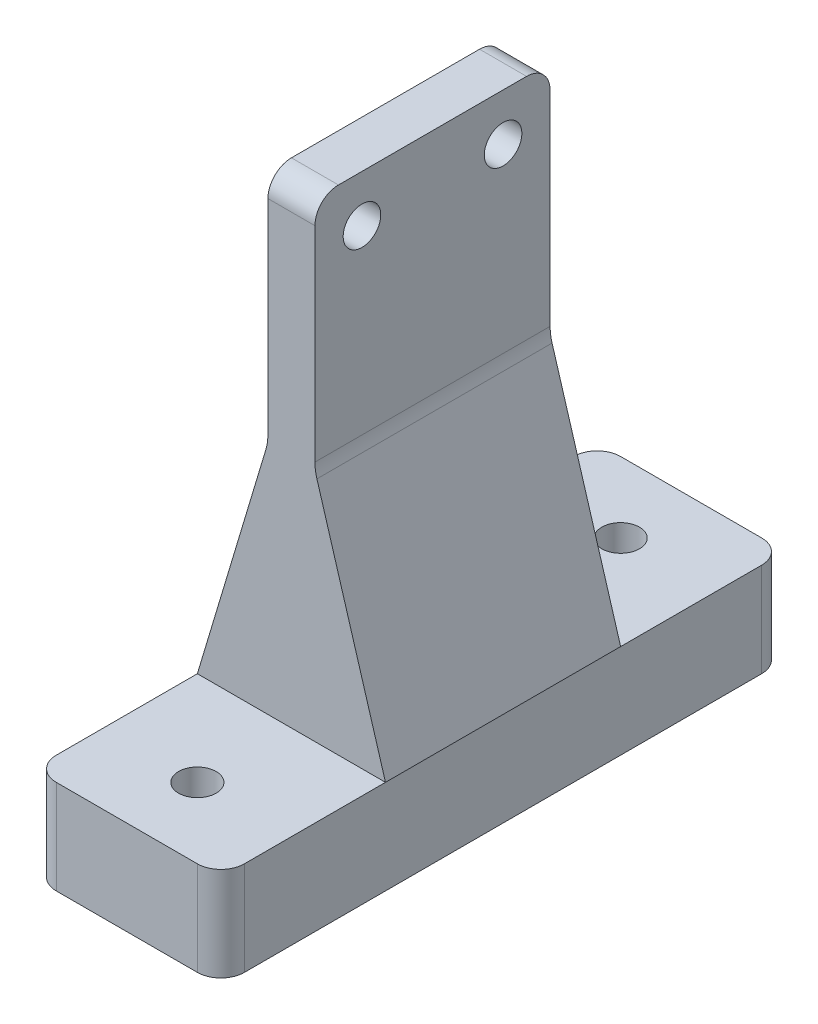
ISO-10303-21;
HEADER;
FILE_DESCRIPTION(('STEP AP214'),'2;1');
FILE_NAME('part.step','',(''),(''),'','','');
FILE_SCHEMA(('AUTOMOTIVE_DESIGN { 1 0 10303 214 1 1 1 1 }'));
ENDSEC;
DATA;
#1=APPLICATION_CONTEXT('core data for automotive mechanical design processes');
#2=APPLICATION_PROTOCOL_DEFINITION('international standard','automotive_design',2000,#1);
#3=PRODUCT_CONTEXT('',#1,'mechanical');
#4=PRODUCT('Part','Part','',(#3));
#5=PRODUCT_RELATED_PRODUCT_CATEGORY('part','',(#4));
#6=PRODUCT_DEFINITION_FORMATION('','',#4);
#7=PRODUCT_DEFINITION_CONTEXT('part definition',#1,'design');
#8=PRODUCT_DEFINITION('design','',#6,#7);
#9=PRODUCT_DEFINITION_SHAPE('','',#8);
#10=(LENGTH_UNIT() NAMED_UNIT(*) SI_UNIT(.MILLI.,.METRE.));
#11=(NAMED_UNIT(*) PLANE_ANGLE_UNIT() SI_UNIT($,.RADIAN.));
#12=(NAMED_UNIT(*) SI_UNIT($,.STERADIAN.) SOLID_ANGLE_UNIT());
#13=UNCERTAINTY_MEASURE_WITH_UNIT(LENGTH_MEASURE(1.E-05),#10,'distance_accuracy_value','');
#14=(GEOMETRIC_REPRESENTATION_CONTEXT(3) GLOBAL_UNCERTAINTY_ASSIGNED_CONTEXT((#13)) GLOBAL_UNIT_ASSIGNED_CONTEXT((#10,
#11,#12)) REPRESENTATION_CONTEXT('',''));
#15=CARTESIAN_POINT('',(0.,0.,0.));
#16=DIRECTION('',(0.,0.,1.));
#17=DIRECTION('',(1.,0.,0.));
#18=AXIS2_PLACEMENT_3D('',#15,#16,#17);
#19=CARTESIAN_POINT('',(0.,20.,0.));
#20=DIRECTION('',(0.,1.,0.));
#21=DIRECTION('',(0.,0.,1.));
#22=AXIS2_PLACEMENT_3D('',#19,#20,#21);
#23=PLANE('',#22);
#24=CARTESIAN_POINT('',(-4.99999999999999,20.,35.));
#25=DIRECTION('',(0.,1.,0.));
#26=DIRECTION('',(0.,0.,1.));
#27=AXIS2_PLACEMENT_3D('',#24,#25,#26);
#28=CIRCLE('',#27,4.);
#29=CARTESIAN_POINT('',(-4.99999999999999,20.,39.));
#30=VERTEX_POINT('',#29);
#31=EDGE_CURVE('E293',#30,#30,#28,.T.);
#32=ORIENTED_EDGE('',*,*,#31,.F.);
#33=EDGE_LOOP('',(#32));
#34=FACE_BOUND('',#33,.T.);
#35=DIRECTION('',(0.,0.,1.));
#36=VECTOR('',#35,1.);
#37=CARTESIAN_POINT('',(15.,20.,0.));
#38=LINE('',#37,#36);
#39=CARTESIAN_POINT('',(15.,20.,15.));
#40=VERTEX_POINT('',#39);
#41=CARTESIAN_POINT('',(15.,20.,45.));
#42=VERTEX_POINT('',#41);
#43=EDGE_CURVE('E210',#40,#42,#38,.T.);
#44=ORIENTED_EDGE('',*,*,#43,.F.);
#45=DIRECTION('',(1.,0.,0.));
#46=VECTOR('',#45,1.);
#47=CARTESIAN_POINT('',(-9.99999999999999,20.,15.));
#48=LINE('',#47,#46);
#49=CARTESIAN_POINT('',(-25.,20.,15.));
#50=VERTEX_POINT('',#49);
#51=EDGE_CURVE('E185',#50,#40,#48,.T.);
#52=ORIENTED_EDGE('',*,*,#51,.F.);
#53=DIRECTION('',(0.,0.,-1.));
#54=VECTOR('',#53,1.);
#55=CARTESIAN_POINT('',(-25.,20.,0.));
#56=LINE('',#55,#54);
#57=CARTESIAN_POINT('',(-25.,20.,45.));
#58=VERTEX_POINT('',#57);
#59=EDGE_CURVE('E345',#58,#50,#56,.T.);
#60=ORIENTED_EDGE('',*,*,#59,.F.);
#61=CARTESIAN_POINT('',(-20.,20.,45.));
#62=DIRECTION('',(0.,1.,0.));
#63=DIRECTION('',(0.,0.,1.));
#64=AXIS2_PLACEMENT_3D('',#61,#62,#63);
#65=CIRCLE('',#64,5.);
#66=CARTESIAN_POINT('',(-20.,20.,50.));
#67=VERTEX_POINT('',#66);
#68=EDGE_CURVE('E274',#58,#67,#65,.T.);
#69=ORIENTED_EDGE('',*,*,#68,.T.);
#70=DIRECTION('',(1.,0.,0.));
#71=VECTOR('',#70,1.);
#72=CARTESIAN_POINT('',(0.,20.,50.));
#73=LINE('',#72,#71);
#74=CARTESIAN_POINT('',(10.,20.,50.));
#75=VERTEX_POINT('',#74);
#76=EDGE_CURVE('E215',#67,#75,#73,.T.);
#77=ORIENTED_EDGE('',*,*,#76,.T.);
#78=CARTESIAN_POINT('',(10.,20.,45.));
#79=DIRECTION('',(0.,1.,0.));
#80=DIRECTION('',(0.,0.,1.));
#81=AXIS2_PLACEMENT_3D('',#78,#79,#80);
#82=CIRCLE('',#81,5.);
#83=EDGE_CURVE('E267',#75,#42,#82,.T.);
#84=ORIENTED_EDGE('',*,*,#83,.T.);
#85=EDGE_LOOP('',(#44,#52,#60,#69,#77,#84));
#86=FACE_BOUND('',#85,.T.);
#87=ADVANCED_FACE('F45',(#34,#86),#23,.T.);
#88=DIRECTION('',(-1.,0.,0.));
#89=VECTOR('',#88,1.);
#90=CARTESIAN_POINT('',(-10.,20.,-35.));
#91=LINE('',#90,#89);
#92=CARTESIAN_POINT('',(15.,20.,-35.));
#93=VERTEX_POINT('',#92);
#94=CARTESIAN_POINT('',(-25.,20.,-35.));
#95=VERTEX_POINT('',#94);
#96=EDGE_CURVE('E171',#93,#95,#91,.T.);
#97=ORIENTED_EDGE('',*,*,#96,.F.);
#98=CARTESIAN_POINT('',(15.,20.,-65.));
#99=VERTEX_POINT('',#98);
#100=EDGE_CURVE('E176',#99,#93,#38,.T.);
#101=ORIENTED_EDGE('',*,*,#100,.F.);
#102=CARTESIAN_POINT('',(9.99999999999998,20.,-65.));
#103=DIRECTION('',(0.,1.,0.));
#104=DIRECTION('',(0.,0.,1.));
#105=AXIS2_PLACEMENT_3D('',#102,#103,#104);
#106=CIRCLE('',#105,5.);
#107=CARTESIAN_POINT('',(9.99999999999998,20.,-70.));
#108=VERTEX_POINT('',#107);
#109=EDGE_CURVE('E270',#99,#108,#106,.T.);
#110=ORIENTED_EDGE('',*,*,#109,.T.);
#111=DIRECTION('',(1.,0.,0.));
#112=VECTOR('',#111,1.);
#113=CARTESIAN_POINT('',(0.,20.,-70.));
#114=LINE('',#113,#112);
#115=CARTESIAN_POINT('',(-20.,20.,-70.));
#116=VERTEX_POINT('',#115);
#117=EDGE_CURVE('E209',#116,#108,#114,.T.);
#118=ORIENTED_EDGE('',*,*,#117,.F.);
#119=CARTESIAN_POINT('',(-20.,20.,-65.));
#120=DIRECTION('',(0.,1.,0.));
#121=DIRECTION('',(0.,0.,1.));
#122=AXIS2_PLACEMENT_3D('',#119,#120,#121);
#123=CIRCLE('',#122,5.);
#124=CARTESIAN_POINT('',(-25.,20.,-65.));
#125=VERTEX_POINT('',#124);
#126=EDGE_CURVE('E272',#116,#125,#123,.T.);
#127=ORIENTED_EDGE('',*,*,#126,.T.);
#128=EDGE_CURVE('E179',#95,#125,#56,.T.);
#129=ORIENTED_EDGE('',*,*,#128,.F.);
#130=EDGE_LOOP('',(#97,#101,#110,#118,#127,#129));
#131=FACE_BOUND('',#130,.T.);
#132=CARTESIAN_POINT('',(-5.,20.,-55.));
#133=DIRECTION('',(0.,1.,0.));
#134=DIRECTION('',(0.,0.,1.));
#135=AXIS2_PLACEMENT_3D('',#132,#133,#134);
#136=CIRCLE('',#135,4.);
#137=CARTESIAN_POINT('',(-5.,20.,-51.));
#138=VERTEX_POINT('',#137);
#139=EDGE_CURVE('E323',#138,#138,#136,.T.);
#140=ORIENTED_EDGE('',*,*,#139,.F.);
#141=EDGE_LOOP('',(#140));
#142=FACE_BOUND('',#141,.T.);
#143=ADVANCED_FACE('F173',(#131,#142),#23,.T.);
#144=CARTESIAN_POINT('',(-25.,20.,0.));
#145=DIRECTION('',(-1.,0.,0.));
#146=DIRECTION('',(0.,0.,1.));
#147=AXIS2_PLACEMENT_3D('',#144,#145,#146);
#148=PLANE('',#147);
#149=DIRECTION('',(0.,0.,-1.));
#150=VECTOR('',#149,1.);
#151=CARTESIAN_POINT('',(-25.,0.,0.));
#152=LINE('',#151,#150);
#153=CARTESIAN_POINT('',(-25.,0.,45.));
#154=VERTEX_POINT('',#153);
#155=CARTESIAN_POINT('',(-25.,0.,-65.));
#156=VERTEX_POINT('',#155);
#157=EDGE_CURVE('E219',#154,#156,#152,.T.);
#158=ORIENTED_EDGE('',*,*,#157,.F.);
#159=DIRECTION('',(0.,-1.,0.));
#160=VECTOR('',#159,1.);
#161=CARTESIAN_POINT('',(-25.,20.,45.));
#162=LINE('',#161,#160);
#163=EDGE_CURVE('E265',#154,#58,#162,.F.);
#164=ORIENTED_EDGE('',*,*,#163,.T.);
#165=ORIENTED_EDGE('',*,*,#59,.T.);
#166=DIRECTION('',(0.,0.,1.));
#167=VECTOR('',#166,1.);
#168=CARTESIAN_POINT('',(-25.,20.,-35.));
#169=LINE('',#168,#167);
#170=EDGE_CURVE('E311',#95,#50,#169,.T.);
#171=ORIENTED_EDGE('',*,*,#170,.F.);
#172=ORIENTED_EDGE('',*,*,#128,.T.);
#173=DIRECTION('',(0.,-1.,0.));
#174=VECTOR('',#173,1.);
#175=CARTESIAN_POINT('',(-25.,20.,-65.));
#176=LINE('',#175,#174);
#177=EDGE_CURVE('E262',#125,#156,#176,.T.);
#178=ORIENTED_EDGE('',*,*,#177,.T.);
#179=EDGE_LOOP('',(#158,#164,#165,#171,#172,#178));
#180=FACE_BOUND('',#179,.T.);
#181=ADVANCED_FACE('F351',(#180),#148,.T.);
#182=CARTESIAN_POINT('',(0.,20.,50.));
#183=DIRECTION('',(0.,0.,-1.));
#184=DIRECTION('',(-1.,0.,0.));
#185=AXIS2_PLACEMENT_3D('',#182,#183,#184);
#186=PLANE('',#185);
#187=ORIENTED_EDGE('',*,*,#76,.F.);
#188=DIRECTION('',(0.,-1.,0.));
#189=VECTOR('',#188,1.);
#190=CARTESIAN_POINT('',(-20.,0.,50.));
#191=LINE('',#190,#189);
#192=CARTESIAN_POINT('',(-20.,0.,50.));
#193=VERTEX_POINT('',#192);
#194=EDGE_CURVE('E251',#67,#193,#191,.T.);
#195=ORIENTED_EDGE('',*,*,#194,.T.);
#196=DIRECTION('',(1.,0.,0.));
#197=VECTOR('',#196,1.);
#198=CARTESIAN_POINT('',(0.,0.,50.));
#199=LINE('',#198,#197);
#200=CARTESIAN_POINT('',(10.,0.,50.));
#201=VERTEX_POINT('',#200);
#202=EDGE_CURVE('E222',#193,#201,#199,.T.);
#203=ORIENTED_EDGE('',*,*,#202,.T.);
#204=DIRECTION('',(0.,-1.,0.));
#205=VECTOR('',#204,1.);
#206=CARTESIAN_POINT('',(10.,20.,50.));
#207=LINE('',#206,#205);
#208=EDGE_CURVE('E249',#201,#75,#207,.F.);
#209=ORIENTED_EDGE('',*,*,#208,.T.);
#210=EDGE_LOOP('',(#187,#195,#203,#209));
#211=FACE_BOUND('',#210,.T.);
#212=ADVANCED_FACE('F374',(#211),#186,.F.);
#213=CARTESIAN_POINT('',(15.,20.,0.));
#214=DIRECTION('',(1.,0.,0.));
#215=DIRECTION('',(0.,0.,-1.));
#216=AXIS2_PLACEMENT_3D('',#213,#214,#215);
#217=PLANE('',#216);
#218=DIRECTION('',(0.,0.,1.));
#219=VECTOR('',#218,1.);
#220=CARTESIAN_POINT('',(15.,0.,0.));
#221=LINE('',#220,#219);
#222=CARTESIAN_POINT('',(15.,0.,-65.));
#223=VERTEX_POINT('',#222);
#224=CARTESIAN_POINT('',(15.,0.,45.));
#225=VERTEX_POINT('',#224);
#226=EDGE_CURVE('E226',#223,#225,#221,.T.);
#227=ORIENTED_EDGE('',*,*,#226,.F.);
#228=DIRECTION('',(0.,-1.,0.));
#229=VECTOR('',#228,1.);
#230=CARTESIAN_POINT('',(15.,20.,-65.));
#231=LINE('',#230,#229);
#232=EDGE_CURVE('E208',#223,#99,#231,.F.);
#233=ORIENTED_EDGE('',*,*,#232,.T.);
#234=ORIENTED_EDGE('',*,*,#100,.T.);
#235=DIRECTION('',(0.,0.,1.));
#236=VECTOR('',#235,1.);
#237=CARTESIAN_POINT('',(15.,20.,-35.));
#238=LINE('',#237,#236);
#239=EDGE_CURVE('E191',#93,#40,#238,.T.);
#240=ORIENTED_EDGE('',*,*,#239,.T.);
#241=ORIENTED_EDGE('',*,*,#43,.T.);
#242=DIRECTION('',(0.,-1.,0.));
#243=VECTOR('',#242,1.);
#244=CARTESIAN_POINT('',(15.,0.,45.));
#245=LINE('',#244,#243);
#246=EDGE_CURVE('E281',#42,#225,#245,.T.);
#247=ORIENTED_EDGE('',*,*,#246,.T.);
#248=EDGE_LOOP('',(#227,#233,#234,#240,#241,#247));
#249=FACE_BOUND('',#248,.T.);
#250=ADVANCED_FACE('F206',(#249),#217,.T.);
#251=CARTESIAN_POINT('',(0.,20.,-70.));
#252=DIRECTION('',(0.,0.,-1.));
#253=DIRECTION('',(-1.,0.,0.));
#254=AXIS2_PLACEMENT_3D('',#251,#252,#253);
#255=PLANE('',#254);
#256=DIRECTION('',(1.,0.,0.));
#257=VECTOR('',#256,1.);
#258=CARTESIAN_POINT('',(0.,0.,-70.));
#259=LINE('',#258,#257);
#260=CARTESIAN_POINT('',(-20.,0.,-70.));
#261=VERTEX_POINT('',#260);
#262=CARTESIAN_POINT('',(9.99999999999998,0.,-70.));
#263=VERTEX_POINT('',#262);
#264=EDGE_CURVE('E229',#261,#263,#259,.T.);
#265=ORIENTED_EDGE('',*,*,#264,.F.);
#266=DIRECTION('',(0.,-1.,0.));
#267=VECTOR('',#266,1.);
#268=CARTESIAN_POINT('',(-20.,20.,-70.));
#269=LINE('',#268,#267);
#270=EDGE_CURVE('E279',#261,#116,#269,.F.);
#271=ORIENTED_EDGE('',*,*,#270,.T.);
#272=ORIENTED_EDGE('',*,*,#117,.T.);
#273=DIRECTION('',(0.,-1.,0.));
#274=VECTOR('',#273,1.);
#275=CARTESIAN_POINT('',(9.99999999999998,20.,-70.));
#276=LINE('',#275,#274);
#277=EDGE_CURVE('E276',#108,#263,#276,.T.);
#278=ORIENTED_EDGE('',*,*,#277,.T.);
#279=EDGE_LOOP('',(#265,#271,#272,#278));
#280=FACE_BOUND('',#279,.T.);
#281=ADVANCED_FACE('F363',(#280),#255,.T.);
#282=CARTESIAN_POINT('',(0.,0.,0.));
#283=DIRECTION('',(0.,1.,0.));
#284=DIRECTION('',(0.,0.,1.));
#285=AXIS2_PLACEMENT_3D('',#282,#283,#284);
#286=PLANE('',#285);
#287=CARTESIAN_POINT('',(-5.,0.,-55.));
#288=DIRECTION('',(0.,1.,0.));
#289=DIRECTION('',(0.,0.,1.));
#290=AXIS2_PLACEMENT_3D('',#287,#288,#289);
#291=CIRCLE('',#290,4.);
#292=CARTESIAN_POINT('',(-5.,0.,-51.));
#293=VERTEX_POINT('',#292);
#294=EDGE_CURVE('E320',#293,#293,#291,.T.);
#295=ORIENTED_EDGE('',*,*,#294,.T.);
#296=EDGE_LOOP('',(#295));
#297=FACE_BOUND('',#296,.T.);
#298=CARTESIAN_POINT('',(-4.99999999999999,0.,35.));
#299=DIRECTION('',(0.,1.,0.));
#300=DIRECTION('',(0.,0.,1.));
#301=AXIS2_PLACEMENT_3D('',#298,#299,#300);
#302=CIRCLE('',#301,4.);
#303=CARTESIAN_POINT('',(-4.99999999999999,0.,39.));
#304=VERTEX_POINT('',#303);
#305=EDGE_CURVE('E326',#304,#304,#302,.T.);
#306=ORIENTED_EDGE('',*,*,#305,.T.);
#307=EDGE_LOOP('',(#306));
#308=FACE_BOUND('',#307,.T.);
#309=ORIENTED_EDGE('',*,*,#202,.F.);
#310=CARTESIAN_POINT('',(-20.,0.,45.));
#311=DIRECTION('',(0.,1.,0.));
#312=DIRECTION('',(0.,0.,1.));
#313=AXIS2_PLACEMENT_3D('',#310,#311,#312);
#314=CIRCLE('',#313,5.);
#315=EDGE_CURVE('E260',#193,#154,#314,.F.);
#316=ORIENTED_EDGE('',*,*,#315,.T.);
#317=ORIENTED_EDGE('',*,*,#157,.T.);
#318=CARTESIAN_POINT('',(-20.,0.,-65.));
#319=DIRECTION('',(0.,1.,0.));
#320=DIRECTION('',(0.,0.,1.));
#321=AXIS2_PLACEMENT_3D('',#318,#319,#320);
#322=CIRCLE('',#321,5.);
#323=EDGE_CURVE('E258',#156,#261,#322,.F.);
#324=ORIENTED_EDGE('',*,*,#323,.T.);
#325=ORIENTED_EDGE('',*,*,#264,.T.);
#326=CARTESIAN_POINT('',(9.99999999999998,0.,-65.));
#327=DIRECTION('',(0.,1.,0.));
#328=DIRECTION('',(0.,0.,1.));
#329=AXIS2_PLACEMENT_3D('',#326,#327,#328);
#330=CIRCLE('',#329,5.);
#331=EDGE_CURVE('E256',#263,#223,#330,.F.);
#332=ORIENTED_EDGE('',*,*,#331,.T.);
#333=ORIENTED_EDGE('',*,*,#226,.T.);
#334=CARTESIAN_POINT('',(10.,0.,45.));
#335=DIRECTION('',(0.,1.,0.));
#336=DIRECTION('',(0.,0.,1.));
#337=AXIS2_PLACEMENT_3D('',#334,#335,#336);
#338=CIRCLE('',#337,5.);
#339=EDGE_CURVE('E254',#225,#201,#338,.F.);
#340=ORIENTED_EDGE('',*,*,#339,.T.);
#341=EDGE_LOOP('',(#309,#316,#317,#324,#325,#332,#333,#340));
#342=FACE_BOUND('',#341,.T.);
#343=ADVANCED_FACE('F361',(#297,#308,#342),#286,.F.);
#344=CARTESIAN_POINT('',(-10.,120.,-35.));
#345=DIRECTION('',(1.,0.,0.));
#346=DIRECTION('',(0.,0.,-1.));
#347=AXIS2_PLACEMENT_3D('',#344,#345,#346);
#348=PLANE('',#347);
#349=CARTESIAN_POINT('',(-9.99999999999999,110.,-25.));
#350=DIRECTION('',(-1.,0.,0.));
#351=DIRECTION('',(0.,0.,1.));
#352=AXIS2_PLACEMENT_3D('',#349,#350,#351);
#353=CIRCLE('',#352,4.);
#354=CARTESIAN_POINT('',(-9.99999999999999,110.,-21.));
#355=VERTEX_POINT('',#354);
#356=EDGE_CURVE('E290',#355,#355,#353,.T.);
#357=ORIENTED_EDGE('',*,*,#356,.F.);
#358=EDGE_LOOP('',(#357));
#359=FACE_BOUND('',#358,.T.);
#360=CARTESIAN_POINT('',(-9.99999999999999,110.,4.99999999999999));
#361=DIRECTION('',(-1.,0.,0.));
#362=DIRECTION('',(0.,0.,1.));
#363=AXIS2_PLACEMENT_3D('',#360,#361,#362);
#364=CIRCLE('',#363,4.);
#365=CARTESIAN_POINT('',(-9.99999999999999,110.,9.));
#366=VERTEX_POINT('',#365);
#367=EDGE_CURVE('E315',#366,#366,#364,.T.);
#368=ORIENTED_EDGE('',*,*,#367,.F.);
#369=EDGE_LOOP('',(#368));
#370=FACE_BOUND('',#369,.T.);
#371=DIRECTION('',(0.,-1.,0.));
#372=VECTOR('',#371,1.);
#373=CARTESIAN_POINT('',(-10.,120.,-35.));
#374=LINE('',#373,#372);
#375=CARTESIAN_POINT('',(-10.,115.,-35.));
#376=VERTEX_POINT('',#375);
#377=CARTESIAN_POINT('',(-10.,71.4676883630352,-35.));
#378=VERTEX_POINT('',#377);
#379=EDGE_CURVE('E336',#376,#378,#374,.T.);
#380=ORIENTED_EDGE('',*,*,#379,.T.);
#381=DIRECTION('',(0.,0.,1.));
#382=VECTOR('',#381,1.);
#383=CARTESIAN_POINT('',(-10.,71.4676883630352,-35.));
#384=LINE('',#383,#382);
#385=CARTESIAN_POINT('',(-9.99999999999999,71.4676883630352,15.));
#386=VERTEX_POINT('',#385);
#387=EDGE_CURVE('E285',#378,#386,#384,.T.);
#388=ORIENTED_EDGE('',*,*,#387,.T.);
#389=DIRECTION('',(0.,-1.,0.));
#390=VECTOR('',#389,1.);
#391=CARTESIAN_POINT('',(-9.99999999999999,120.,15.));
#392=LINE('',#391,#390);
#393=CARTESIAN_POINT('',(-9.99999999999999,115.,15.));
#394=VERTEX_POINT('',#393);
#395=EDGE_CURVE('E223',#394,#386,#392,.T.);
#396=ORIENTED_EDGE('',*,*,#395,.F.);
#397=CARTESIAN_POINT('',(-9.99999999999999,115.,9.99999999999999));
#398=DIRECTION('',(1.,0.,0.));
#399=DIRECTION('',(0.,0.,-1.));
#400=AXIS2_PLACEMENT_3D('',#397,#398,#399);
#401=CIRCLE('',#400,5.);
#402=CARTESIAN_POINT('',(-9.99999999999999,120.,9.99999999999998));
#403=VERTEX_POINT('',#402);
#404=EDGE_CURVE('E245',#394,#403,#401,.F.);
#405=ORIENTED_EDGE('',*,*,#404,.T.);
#406=DIRECTION('',(0.,0.,1.));
#407=VECTOR('',#406,1.);
#408=CARTESIAN_POINT('',(-10.,120.,-35.));
#409=LINE('',#408,#407);
#410=CARTESIAN_POINT('',(-10.,120.,-30.));
#411=VERTEX_POINT('',#410);
#412=EDGE_CURVE('E184',#411,#403,#409,.T.);
#413=ORIENTED_EDGE('',*,*,#412,.F.);
#414=CARTESIAN_POINT('',(-10.,115.,-30.));
#415=DIRECTION('',(1.,0.,0.));
#416=DIRECTION('',(0.,0.,-1.));
#417=AXIS2_PLACEMENT_3D('',#414,#415,#416);
#418=CIRCLE('',#417,5.);
#419=EDGE_CURVE('E243',#411,#376,#418,.F.);
#420=ORIENTED_EDGE('',*,*,#419,.T.);
#421=EDGE_LOOP('',(#380,#388,#396,#405,#413,#420));
#422=FACE_BOUND('',#421,.T.);
#423=ADVANCED_FACE('F391',(#359,#370,#422),#348,.F.);
#424=CARTESIAN_POINT('',(-9.99999999999999,120.,15.));
#425=DIRECTION('',(0.,0.,-1.));
#426=DIRECTION('',(-1.,0.,0.));
#427=AXIS2_PLACEMENT_3D('',#424,#425,#426);
#428=PLANE('',#427);
#429=DIRECTION('',(0.,-1.,0.));
#430=VECTOR('',#429,1.);
#431=CARTESIAN_POINT('',(0.,120.,15.));
#432=LINE('',#431,#430);
#433=CARTESIAN_POINT('',(0.,115.,15.));
#434=VERTEX_POINT('',#433);
#435=CARTESIAN_POINT('',(0.,71.4676883630352,15.));
#436=VERTEX_POINT('',#435);
#437=EDGE_CURVE('E342',#434,#436,#432,.T.);
#438=ORIENTED_EDGE('',*,*,#437,.F.);
#439=DIRECTION('',(1.,0.,0.));
#440=VECTOR('',#439,1.);
#441=CARTESIAN_POINT('',(-9.99999999999999,115.,15.));
#442=LINE('',#441,#440);
#443=EDGE_CURVE('E241',#434,#394,#442,.F.);
#444=ORIENTED_EDGE('',*,*,#443,.T.);
#445=ORIENTED_EDGE('',*,*,#395,.T.);
#446=CARTESIAN_POINT('',(-20.,71.4676883630352,15.));
#447=DIRECTION('',(0.,0.,-1.));
#448=DIRECTION('',(-1.,0.,0.));
#449=AXIS2_PLACEMENT_3D('',#446,#447,#448);
#450=CIRCLE('',#449,10.);
#451=CARTESIAN_POINT('',(-10.4217371477885,68.5942095073717,15.));
#452=VERTEX_POINT('',#451);
#453=EDGE_CURVE('E298',#386,#452,#450,.T.);
#454=ORIENTED_EDGE('',*,*,#453,.T.);
#455=DIRECTION('',(-0.287347885566345,-0.957826285221151,0.));
#456=VECTOR('',#455,1.);
#457=CARTESIAN_POINT('',(-9.99999999999999,70.,15.));
#458=LINE('',#457,#456);
#459=EDGE_CURVE('E199',#452,#50,#458,.T.);
#460=ORIENTED_EDGE('',*,*,#459,.T.);
#461=ORIENTED_EDGE('',*,*,#51,.T.);
#462=DIRECTION('',(-0.287347885566345,0.957826285221151,0.));
#463=VECTOR('',#462,1.);
#464=CARTESIAN_POINT('',(0.,70.,15.));
#465=LINE('',#464,#463);
#466=CARTESIAN_POINT('',(0.42173714778849,68.5942095073717,15.));
#467=VERTEX_POINT('',#466);
#468=EDGE_CURVE('E196',#40,#467,#465,.T.);
#469=ORIENTED_EDGE('',*,*,#468,.T.);
#470=CARTESIAN_POINT('',(10.,71.4676883630352,15.));
#471=DIRECTION('',(0.,0.,-1.));
#472=DIRECTION('',(-1.,0.,0.));
#473=AXIS2_PLACEMENT_3D('',#470,#471,#472);
#474=CIRCLE('',#473,10.);
#475=EDGE_CURVE('E53',#467,#436,#474,.T.);
#476=ORIENTED_EDGE('',*,*,#475,.T.);
#477=EDGE_LOOP('',(#438,#444,#445,#454,#460,#461,#469,#476));
#478=FACE_BOUND('',#477,.T.);
#479=ADVANCED_FACE('F305',(#478),#428,.F.);
#480=CARTESIAN_POINT('',(0.,120.,-35.));
#481=DIRECTION('',(-1.,0.,0.));
#482=DIRECTION('',(0.,0.,1.));
#483=AXIS2_PLACEMENT_3D('',#480,#481,#482);
#484=PLANE('',#483);
#485=CARTESIAN_POINT('',(0.,110.,-25.));
#486=DIRECTION('',(-1.,0.,0.));
#487=DIRECTION('',(0.,0.,1.));
#488=AXIS2_PLACEMENT_3D('',#485,#486,#487);
#489=CIRCLE('',#488,4.);
#490=CARTESIAN_POINT('',(0.,110.,-21.));
#491=VERTEX_POINT('',#490);
#492=EDGE_CURVE('E289',#491,#491,#489,.T.);
#493=ORIENTED_EDGE('',*,*,#492,.T.);
#494=EDGE_LOOP('',(#493));
#495=FACE_BOUND('',#494,.T.);
#496=CARTESIAN_POINT('',(0.,110.,4.99999999999999));
#497=DIRECTION('',(-1.,0.,0.));
#498=DIRECTION('',(0.,0.,1.));
#499=AXIS2_PLACEMENT_3D('',#496,#497,#498);
#500=CIRCLE('',#499,4.);
#501=CARTESIAN_POINT('',(0.,110.,8.99999999999999));
#502=VERTEX_POINT('',#501);
#503=EDGE_CURVE('E286',#502,#502,#500,.T.);
#504=ORIENTED_EDGE('',*,*,#503,.T.);
#505=EDGE_LOOP('',(#504));
#506=FACE_BOUND('',#505,.T.);
#507=ORIENTED_EDGE('',*,*,#437,.T.);
#508=DIRECTION('',(0.,0.,1.));
#509=VECTOR('',#508,1.);
#510=CARTESIAN_POINT('',(0.,71.4676883630352,-35.));
#511=LINE('',#510,#509);
#512=CARTESIAN_POINT('',(0.,71.4676883630352,-35.));
#513=VERTEX_POINT('',#512);
#514=EDGE_CURVE('E60',#436,#513,#511,.F.);
#515=ORIENTED_EDGE('',*,*,#514,.T.);
#516=DIRECTION('',(0.,-1.,0.));
#517=VECTOR('',#516,1.);
#518=CARTESIAN_POINT('',(0.,120.,-35.));
#519=LINE('',#518,#517);
#520=CARTESIAN_POINT('',(0.,115.,-35.));
#521=VERTEX_POINT('',#520);
#522=EDGE_CURVE('E340',#521,#513,#519,.T.);
#523=ORIENTED_EDGE('',*,*,#522,.F.);
#524=CARTESIAN_POINT('',(0.,115.,-30.));
#525=DIRECTION('',(-1.,0.,0.));
#526=DIRECTION('',(0.,0.,1.));
#527=AXIS2_PLACEMENT_3D('',#524,#525,#526);
#528=CIRCLE('',#527,5.);
#529=CARTESIAN_POINT('',(0.,120.,-30.));
#530=VERTEX_POINT('',#529);
#531=EDGE_CURVE('E237',#521,#530,#528,.F.);
#532=ORIENTED_EDGE('',*,*,#531,.T.);
#533=DIRECTION('',(0.,0.,-1.));
#534=VECTOR('',#533,1.);
#535=CARTESIAN_POINT('',(0.,120.,-35.));
#536=LINE('',#535,#534);
#537=CARTESIAN_POINT('',(0.,120.,9.99999999999999));
#538=VERTEX_POINT('',#537);
#539=EDGE_CURVE('E333',#538,#530,#536,.T.);
#540=ORIENTED_EDGE('',*,*,#539,.F.);
#541=CARTESIAN_POINT('',(0.,115.,9.99999999999999));
#542=DIRECTION('',(-1.,0.,0.));
#543=DIRECTION('',(0.,0.,1.));
#544=AXIS2_PLACEMENT_3D('',#541,#542,#543);
#545=CIRCLE('',#544,5.);
#546=EDGE_CURVE('E239',#538,#434,#545,.F.);
#547=ORIENTED_EDGE('',*,*,#546,.T.);
#548=EDGE_LOOP('',(#507,#515,#523,#532,#540,#547));
#549=FACE_BOUND('',#548,.T.);
#550=ADVANCED_FACE('F445',(#495,#506,#549),#484,.F.);
#551=CARTESIAN_POINT('',(-10.,120.,-35.));
#552=DIRECTION('',(0.,0.,1.));
#553=DIRECTION('',(1.,0.,0.));
#554=AXIS2_PLACEMENT_3D('',#551,#552,#553);
#555=PLANE('',#554);
#556=ORIENTED_EDGE('',*,*,#379,.F.);
#557=DIRECTION('',(-1.,0.,0.));
#558=VECTOR('',#557,1.);
#559=CARTESIAN_POINT('',(0.,115.,-35.));
#560=LINE('',#559,#558);
#561=EDGE_CURVE('E247',#376,#521,#560,.F.);
#562=ORIENTED_EDGE('',*,*,#561,.T.);
#563=ORIENTED_EDGE('',*,*,#522,.T.);
#564=CARTESIAN_POINT('',(10.,71.4676883630352,-35.));
#565=DIRECTION('',(0.,0.,1.));
#566=DIRECTION('',(1.,0.,0.));
#567=AXIS2_PLACEMENT_3D('',#564,#565,#566);
#568=CIRCLE('',#567,10.);
#569=CARTESIAN_POINT('',(0.421737147788482,68.5942095073717,-35.));
#570=VERTEX_POINT('',#569);
#571=EDGE_CURVE('E11',#513,#570,#568,.T.);
#572=ORIENTED_EDGE('',*,*,#571,.T.);
#573=DIRECTION('',(-0.287347885566345,0.957826285221151,0.));
#574=VECTOR('',#573,1.);
#575=CARTESIAN_POINT('',(0.,70.,-35.));
#576=LINE('',#575,#574);
#577=EDGE_CURVE('E194',#93,#570,#576,.T.);
#578=ORIENTED_EDGE('',*,*,#577,.F.);
#579=ORIENTED_EDGE('',*,*,#96,.T.);
#580=DIRECTION('',(-0.287347885566345,-0.957826285221151,0.));
#581=VECTOR('',#580,1.);
#582=CARTESIAN_POINT('',(-9.99999999999999,70.,-35.));
#583=LINE('',#582,#581);
#584=CARTESIAN_POINT('',(-10.4217371477885,68.5942095073717,-35.));
#585=VERTEX_POINT('',#584);
#586=EDGE_CURVE('E309',#585,#95,#583,.T.);
#587=ORIENTED_EDGE('',*,*,#586,.F.);
#588=CARTESIAN_POINT('',(-20.,71.4676883630352,-35.));
#589=DIRECTION('',(0.,0.,1.));
#590=DIRECTION('',(1.,0.,0.));
#591=AXIS2_PLACEMENT_3D('',#588,#589,#590);
#592=CIRCLE('',#591,10.);
#593=EDGE_CURVE('E300',#585,#378,#592,.T.);
#594=ORIENTED_EDGE('',*,*,#593,.T.);
#595=EDGE_LOOP('',(#556,#562,#563,#572,#578,#579,#587,#594));
#596=FACE_BOUND('',#595,.T.);
#597=ADVANCED_FACE('F202',(#596),#555,.F.);
#598=CARTESIAN_POINT('',(0.,120.,0.));
#599=DIRECTION('',(0.,1.,0.));
#600=DIRECTION('',(0.,0.,1.));
#601=AXIS2_PLACEMENT_3D('',#598,#599,#600);
#602=PLANE('',#601);
#603=ORIENTED_EDGE('',*,*,#412,.T.);
#604=DIRECTION('',(1.,0.,0.));
#605=VECTOR('',#604,1.);
#606=CARTESIAN_POINT('',(0.,120.,9.99999999999999));
#607=LINE('',#606,#605);
#608=EDGE_CURVE('E234',#403,#538,#607,.T.);
#609=ORIENTED_EDGE('',*,*,#608,.T.);
#610=ORIENTED_EDGE('',*,*,#539,.T.);
#611=DIRECTION('',(-1.,0.,0.));
#612=VECTOR('',#611,1.);
#613=CARTESIAN_POINT('',(-9.99999999999999,120.,-30.));
#614=LINE('',#613,#612);
#615=EDGE_CURVE('E213',#530,#411,#614,.T.);
#616=ORIENTED_EDGE('',*,*,#615,.T.);
#617=EDGE_LOOP('',(#603,#609,#610,#616));
#618=FACE_BOUND('',#617,.T.);
#619=ADVANCED_FACE('F442',(#618),#602,.T.);
#620=CARTESIAN_POINT('',(-4.99999999999999,0.,35.));
#621=DIRECTION('',(0.,1.,0.));
#622=DIRECTION('',(0.,0.,1.));
#623=AXIS2_PLACEMENT_3D('',#620,#621,#622);
#624=CYLINDRICAL_SURFACE('',#623,4.);
#625=ORIENTED_EDGE('',*,*,#305,.F.);
#626=EDGE_LOOP('',(#625));
#627=FACE_BOUND('',#626,.T.);
#628=ORIENTED_EDGE('',*,*,#31,.T.);
#629=EDGE_LOOP('',(#628));
#630=FACE_BOUND('',#629,.T.);
#631=ADVANCED_FACE('F547',(#627,#630),#624,.F.);
#632=CARTESIAN_POINT('',(-5.,0.,-55.));
#633=DIRECTION('',(0.,1.,0.));
#634=DIRECTION('',(0.,0.,1.));
#635=AXIS2_PLACEMENT_3D('',#632,#633,#634);
#636=CYLINDRICAL_SURFACE('',#635,4.);
#637=ORIENTED_EDGE('',*,*,#294,.F.);
#638=EDGE_LOOP('',(#637));
#639=FACE_BOUND('',#638,.T.);
#640=ORIENTED_EDGE('',*,*,#139,.T.);
#641=EDGE_LOOP('',(#640));
#642=FACE_BOUND('',#641,.T.);
#643=ADVANCED_FACE('F408',(#639,#642),#636,.F.);
#644=CARTESIAN_POINT('',(0.,115.,9.99999999999999));
#645=DIRECTION('',(-1.,0.,0.));
#646=DIRECTION('',(0.,0.,1.));
#647=AXIS2_PLACEMENT_3D('',#644,#645,#646);
#648=CYLINDRICAL_SURFACE('',#647,5.);
#649=ORIENTED_EDGE('',*,*,#404,.F.);
#650=ORIENTED_EDGE('',*,*,#443,.F.);
#651=ORIENTED_EDGE('',*,*,#546,.F.);
#652=ORIENTED_EDGE('',*,*,#608,.F.);
#653=EDGE_LOOP('',(#649,#650,#651,#652));
#654=FACE_BOUND('',#653,.T.);
#655=ADVANCED_FACE('F404',(#654),#648,.T.);
#656=CARTESIAN_POINT('',(0.,115.,-30.));
#657=DIRECTION('',(1.,0.,0.));
#658=DIRECTION('',(0.,0.,-1.));
#659=AXIS2_PLACEMENT_3D('',#656,#657,#658);
#660=CYLINDRICAL_SURFACE('',#659,5.);
#661=ORIENTED_EDGE('',*,*,#531,.F.);
#662=ORIENTED_EDGE('',*,*,#561,.F.);
#663=ORIENTED_EDGE('',*,*,#419,.F.);
#664=ORIENTED_EDGE('',*,*,#615,.F.);
#665=EDGE_LOOP('',(#661,#662,#663,#664));
#666=FACE_BOUND('',#665,.T.);
#667=ADVANCED_FACE('F407',(#666),#660,.T.);
#668=CARTESIAN_POINT('',(-20.,20.,45.));
#669=DIRECTION('',(0.,1.,0.));
#670=DIRECTION('',(0.,0.,1.));
#671=AXIS2_PLACEMENT_3D('',#668,#669,#670);
#672=CYLINDRICAL_SURFACE('',#671,5.);
#673=ORIENTED_EDGE('',*,*,#68,.F.);
#674=ORIENTED_EDGE('',*,*,#163,.F.);
#675=ORIENTED_EDGE('',*,*,#315,.F.);
#676=ORIENTED_EDGE('',*,*,#194,.F.);
#677=EDGE_LOOP('',(#673,#674,#675,#676));
#678=FACE_BOUND('',#677,.T.);
#679=ADVANCED_FACE('F378',(#678),#672,.T.);
#680=CARTESIAN_POINT('',(-20.,20.,-65.));
#681=DIRECTION('',(0.,-1.,0.));
#682=DIRECTION('',(0.,0.,-1.));
#683=AXIS2_PLACEMENT_3D('',#680,#681,#682);
#684=CYLINDRICAL_SURFACE('',#683,5.);
#685=ORIENTED_EDGE('',*,*,#126,.F.);
#686=ORIENTED_EDGE('',*,*,#270,.F.);
#687=ORIENTED_EDGE('',*,*,#323,.F.);
#688=ORIENTED_EDGE('',*,*,#177,.F.);
#689=EDGE_LOOP('',(#685,#686,#687,#688));
#690=FACE_BOUND('',#689,.T.);
#691=ADVANCED_FACE('F357',(#690),#684,.T.);
#692=CARTESIAN_POINT('',(9.99999999999998,20.,-65.));
#693=DIRECTION('',(0.,-1.,0.));
#694=DIRECTION('',(0.,0.,-1.));
#695=AXIS2_PLACEMENT_3D('',#692,#693,#694);
#696=CYLINDRICAL_SURFACE('',#695,5.);
#697=ORIENTED_EDGE('',*,*,#109,.F.);
#698=ORIENTED_EDGE('',*,*,#232,.F.);
#699=ORIENTED_EDGE('',*,*,#331,.F.);
#700=ORIENTED_EDGE('',*,*,#277,.F.);
#701=EDGE_LOOP('',(#697,#698,#699,#700));
#702=FACE_BOUND('',#701,.T.);
#703=ADVANCED_FACE('F366',(#702),#696,.T.);
#704=CARTESIAN_POINT('',(10.,20.,45.));
#705=DIRECTION('',(0.,1.,0.));
#706=DIRECTION('',(0.,0.,1.));
#707=AXIS2_PLACEMENT_3D('',#704,#705,#706);
#708=CYLINDRICAL_SURFACE('',#707,5.);
#709=ORIENTED_EDGE('',*,*,#83,.F.);
#710=ORIENTED_EDGE('',*,*,#208,.F.);
#711=ORIENTED_EDGE('',*,*,#339,.F.);
#712=ORIENTED_EDGE('',*,*,#246,.F.);
#713=EDGE_LOOP('',(#709,#710,#711,#712));
#714=FACE_BOUND('',#713,.T.);
#715=ADVANCED_FACE('F370',(#714),#708,.T.);
#716=CARTESIAN_POINT('',(15.,110.,4.99999999999999));
#717=DIRECTION('',(-1.,0.,0.));
#718=DIRECTION('',(0.,0.,1.));
#719=AXIS2_PLACEMENT_3D('',#716,#717,#718);
#720=CYLINDRICAL_SURFACE('',#719,4.);
#721=ORIENTED_EDGE('',*,*,#367,.T.);
#722=EDGE_LOOP('',(#721));
#723=FACE_BOUND('',#722,.T.);
#724=ORIENTED_EDGE('',*,*,#503,.F.);
#725=EDGE_LOOP('',(#724));
#726=FACE_BOUND('',#725,.T.);
#727=ADVANCED_FACE('F420',(#723,#726),#720,.F.);
#728=CARTESIAN_POINT('',(15.,110.,-25.));
#729=DIRECTION('',(-1.,0.,0.));
#730=DIRECTION('',(0.,0.,1.));
#731=AXIS2_PLACEMENT_3D('',#728,#729,#730);
#732=CYLINDRICAL_SURFACE('',#731,4.);
#733=ORIENTED_EDGE('',*,*,#356,.T.);
#734=EDGE_LOOP('',(#733));
#735=FACE_BOUND('',#734,.T.);
#736=ORIENTED_EDGE('',*,*,#492,.F.);
#737=EDGE_LOOP('',(#736));
#738=FACE_BOUND('',#737,.T.);
#739=ADVANCED_FACE('F429',(#735,#738),#732,.F.);
#740=CARTESIAN_POINT('',(-9.99999999999999,70.,-35.));
#741=DIRECTION('',(-0.957826285221152,0.287347885566345,0.));
#742=DIRECTION('',(-0.287347885566345,-0.957826285221152,0.));
#743=AXIS2_PLACEMENT_3D('',#740,#741,#742);
#744=PLANE('',#743);
#745=ORIENTED_EDGE('',*,*,#459,.F.);
#746=DIRECTION('',(0.,0.,1.));
#747=VECTOR('',#746,1.);
#748=CARTESIAN_POINT('',(-10.4217371477885,68.5942095073717,-35.));
#749=LINE('',#748,#747);
#750=EDGE_CURVE('E296',#452,#585,#749,.F.);
#751=ORIENTED_EDGE('',*,*,#750,.T.);
#752=ORIENTED_EDGE('',*,*,#586,.T.);
#753=ORIENTED_EDGE('',*,*,#170,.T.);
#754=EDGE_LOOP('',(#745,#751,#752,#753));
#755=FACE_BOUND('',#754,.T.);
#756=ADVANCED_FACE('F422',(#755),#744,.T.);
#757=CARTESIAN_POINT('',(-20.,71.4676883630352,-35.));
#758=DIRECTION('',(0.,0.,1.));
#759=DIRECTION('',(0.,-1.,0.));
#760=AXIS2_PLACEMENT_3D('',#757,#758,#759);
#761=CYLINDRICAL_SURFACE('',#760,10.);
#762=ORIENTED_EDGE('',*,*,#593,.F.);
#763=ORIENTED_EDGE('',*,*,#750,.F.);
#764=ORIENTED_EDGE('',*,*,#453,.F.);
#765=ORIENTED_EDGE('',*,*,#387,.F.);
#766=EDGE_LOOP('',(#762,#763,#764,#765));
#767=FACE_BOUND('',#766,.T.);
#768=ADVANCED_FACE('F421',(#767),#761,.F.);
#769=CARTESIAN_POINT('',(0.,70.,-35.));
#770=DIRECTION('',(0.957826285221152,0.287347885566345,0.));
#771=DIRECTION('',(-0.287347885566345,0.957826285221152,0.));
#772=AXIS2_PLACEMENT_3D('',#769,#770,#771);
#773=PLANE('',#772);
#774=ORIENTED_EDGE('',*,*,#577,.T.);
#775=DIRECTION('',(0.,0.,1.));
#776=VECTOR('',#775,1.);
#777=CARTESIAN_POINT('',(0.421737147788484,68.5942095073717,-35.));
#778=LINE('',#777,#776);
#779=EDGE_CURVE('E302',#570,#467,#778,.T.);
#780=ORIENTED_EDGE('',*,*,#779,.T.);
#781=ORIENTED_EDGE('',*,*,#468,.F.);
#782=ORIENTED_EDGE('',*,*,#239,.F.);
#783=EDGE_LOOP('',(#774,#780,#781,#782));
#784=FACE_BOUND('',#783,.T.);
#785=ADVANCED_FACE('F192',(#784),#773,.T.);
#786=CARTESIAN_POINT('',(10.,71.4676883630352,-35.));
#787=DIRECTION('',(0.,0.,1.));
#788=DIRECTION('',(0.,-1.,0.));
#789=AXIS2_PLACEMENT_3D('',#786,#787,#788);
#790=CYLINDRICAL_SURFACE('',#789,10.);
#791=ORIENTED_EDGE('',*,*,#571,.F.);
#792=ORIENTED_EDGE('',*,*,#514,.F.);
#793=ORIENTED_EDGE('',*,*,#475,.F.);
#794=ORIENTED_EDGE('',*,*,#779,.F.);
#795=EDGE_LOOP('',(#791,#792,#793,#794));
#796=FACE_BOUND('',#795,.T.);
#797=ADVANCED_FACE('F47',(#796),#790,.F.);
#798=CLOSED_SHELL('',(#87,#143,#181,#212,#250,#281,#343,#423,#479,#550,#597,#619,#631,#643,#655,
#667,#679,#691,#703,#715,#727,#739,#756,#768,#785,#797));
#799=MANIFOLD_SOLID_BREP('B2',#798);
#800=ADVANCED_BREP_SHAPE_REPRESENTATION('',(#18,#799),#14);
#801=SHAPE_DEFINITION_REPRESENTATION(#9,#800);
ENDSEC;
END-ISO-10303-21;
